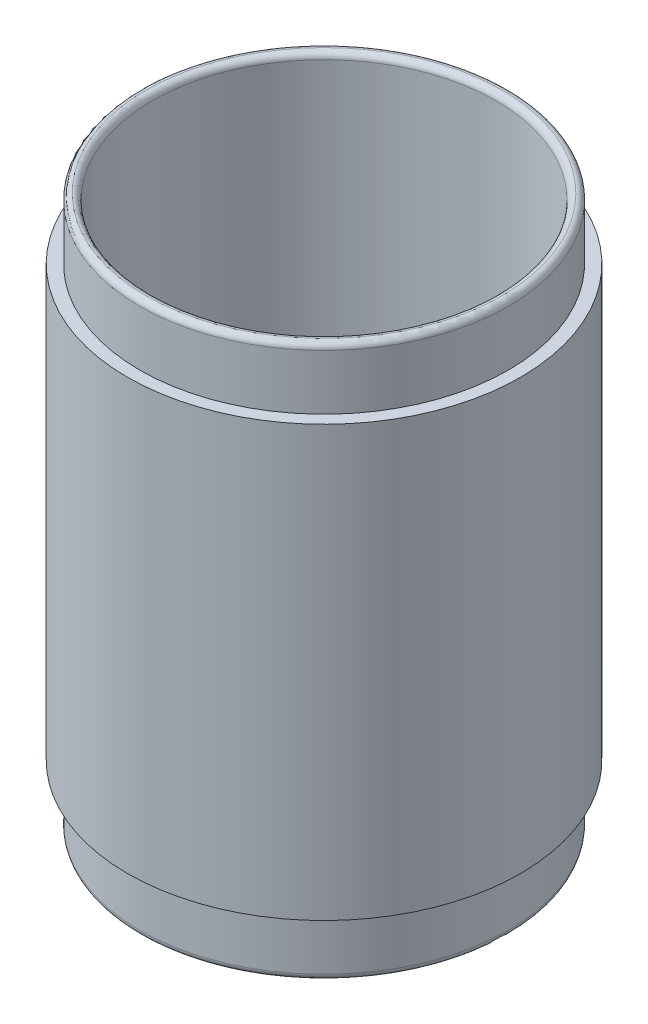
ISO-10303-21;
HEADER;
FILE_DESCRIPTION(('STEP AP214'),'2;1');
FILE_NAME('part.step','',(''),(''),'','','');
FILE_SCHEMA(('AUTOMOTIVE_DESIGN { 1 0 10303 214 1 1 1 1 }'));
ENDSEC;
DATA;
#1=APPLICATION_CONTEXT('core data for automotive mechanical design processes');
#2=APPLICATION_PROTOCOL_DEFINITION('international standard','automotive_design',2000,#1);
#3=PRODUCT_CONTEXT('',#1,'mechanical');
#4=PRODUCT('Part','Part','',(#3));
#5=PRODUCT_RELATED_PRODUCT_CATEGORY('part','',(#4));
#6=PRODUCT_DEFINITION_FORMATION('','',#4);
#7=PRODUCT_DEFINITION_CONTEXT('part definition',#1,'design');
#8=PRODUCT_DEFINITION('design','',#6,#7);
#9=PRODUCT_DEFINITION_SHAPE('','',#8);
#10=(LENGTH_UNIT() NAMED_UNIT(*) SI_UNIT(.MILLI.,.METRE.));
#11=(NAMED_UNIT(*) PLANE_ANGLE_UNIT() SI_UNIT($,.RADIAN.));
#12=(NAMED_UNIT(*) SI_UNIT($,.STERADIAN.) SOLID_ANGLE_UNIT());
#13=UNCERTAINTY_MEASURE_WITH_UNIT(LENGTH_MEASURE(1.E-05),#10,'distance_accuracy_value','');
#14=(GEOMETRIC_REPRESENTATION_CONTEXT(3) GLOBAL_UNCERTAINTY_ASSIGNED_CONTEXT((#13)) GLOBAL_UNIT_ASSIGNED_CONTEXT((#10,
#11,#12)) REPRESENTATION_CONTEXT('',''));
#15=CARTESIAN_POINT('',(0.,0.,0.));
#16=DIRECTION('',(0.,0.,1.));
#17=DIRECTION('',(1.,0.,0.));
#18=AXIS2_PLACEMENT_3D('',#15,#16,#17);
#19=CARTESIAN_POINT('',(0.,0.,0.));
#20=DIRECTION('',(0.,1.,0.));
#21=DIRECTION('',(0.,0.,1.));
#22=AXIS2_PLACEMENT_3D('',#19,#20,#21);
#23=PLANE('',#22);
#24=CARTESIAN_POINT('',(0.,0.,0.));
#25=DIRECTION('',(0.,1.,0.));
#26=DIRECTION('',(0.,0.,1.));
#27=AXIS2_PLACEMENT_3D('',#24,#25,#26);
#28=CIRCLE('',#27,16.);
#29=CARTESIAN_POINT('',(0.,0.,16.));
#30=VERTEX_POINT('',#29);
#31=EDGE_CURVE('E59',#30,#30,#28,.T.);
#32=ORIENTED_EDGE('',*,*,#31,.F.);
#33=EDGE_LOOP('',(#32));
#34=FACE_BOUND('',#33,.T.);
#35=CARTESIAN_POINT('',(0.,0.,0.));
#36=DIRECTION('',(0.,1.,0.));
#37=DIRECTION('',(0.,0.,1.));
#38=AXIS2_PLACEMENT_3D('',#35,#36,#37);
#39=CIRCLE('',#38,15.);
#40=CARTESIAN_POINT('',(0.,0.,15.));
#41=VERTEX_POINT('',#40);
#42=EDGE_CURVE('E112',#41,#41,#39,.F.);
#43=ORIENTED_EDGE('',*,*,#42,.F.);
#44=EDGE_LOOP('',(#43));
#45=FACE_BOUND('',#44,.T.);
#46=ADVANCED_FACE('F37',(#34,#45),#23,.F.);
#47=CARTESIAN_POINT('',(0.,35.,0.));
#48=DIRECTION('',(0.,1.,0.));
#49=DIRECTION('',(0.,0.,1.));
#50=AXIS2_PLACEMENT_3D('',#47,#48,#49);
#51=PLANE('',#50);
#52=CARTESIAN_POINT('',(0.,35.,0.));
#53=DIRECTION('',(0.,1.,0.));
#54=DIRECTION('',(0.,0.,1.));
#55=AXIS2_PLACEMENT_3D('',#52,#53,#54);
#56=CIRCLE('',#55,16.);
#57=CARTESIAN_POINT('',(0.,35.,16.));
#58=VERTEX_POINT('',#57);
#59=EDGE_CURVE('E117',#58,#58,#56,.T.);
#60=ORIENTED_EDGE('',*,*,#59,.T.);
#61=EDGE_LOOP('',(#60));
#62=FACE_BOUND('',#61,.T.);
#63=CARTESIAN_POINT('',(0.,35.,0.));
#64=DIRECTION('',(0.,1.,0.));
#65=DIRECTION('',(0.,0.,1.));
#66=AXIS2_PLACEMENT_3D('',#63,#64,#65);
#67=CIRCLE('',#66,15.);
#68=CARTESIAN_POINT('',(0.,35.,15.));
#69=VERTEX_POINT('',#68);
#70=EDGE_CURVE('E55',#69,#69,#67,.T.);
#71=ORIENTED_EDGE('',*,*,#70,.F.);
#72=EDGE_LOOP('',(#71));
#73=FACE_BOUND('',#72,.T.);
#74=ADVANCED_FACE('F78',(#62,#73),#51,.T.);
#75=CARTESIAN_POINT('',(0.,35.,0.));
#76=DIRECTION('',(0.,-1.,0.));
#77=DIRECTION('',(0.,0.,-1.));
#78=AXIS2_PLACEMENT_3D('',#75,#76,#77);
#79=CYLINDRICAL_SURFACE('',#78,16.);
#80=ORIENTED_EDGE('',*,*,#59,.F.);
#81=EDGE_LOOP('',(#80));
#82=FACE_BOUND('',#81,.T.);
#83=ORIENTED_EDGE('',*,*,#31,.T.);
#84=EDGE_LOOP('',(#83));
#85=FACE_BOUND('',#84,.T.);
#86=ADVANCED_FACE('F84',(#82,#85),#79,.T.);
#87=CARTESIAN_POINT('',(0.,35.,0.));
#88=DIRECTION('',(0.,-1.,0.));
#89=DIRECTION('',(0.,0.,-1.));
#90=AXIS2_PLACEMENT_3D('',#87,#88,#89);
#91=CYLINDRICAL_SURFACE('',#90,14.);
#92=CARTESIAN_POINT('',(0.,39.5,0.));
#93=DIRECTION('',(0.,1.,0.));
#94=DIRECTION('',(0.,0.,1.));
#95=AXIS2_PLACEMENT_3D('',#92,#93,#94);
#96=CIRCLE('',#95,14.);
#97=CARTESIAN_POINT('',(0.,39.5,14.));
#98=VERTEX_POINT('',#97);
#99=EDGE_CURVE('E45',#98,#98,#96,.T.);
#100=ORIENTED_EDGE('',*,*,#99,.T.);
#101=EDGE_LOOP('',(#100));
#102=FACE_BOUND('',#101,.T.);
#103=CARTESIAN_POINT('',(0.,-4.5,0.));
#104=DIRECTION('',(0.,-1.,0.));
#105=DIRECTION('',(0.,0.,-1.));
#106=AXIS2_PLACEMENT_3D('',#103,#104,#105);
#107=CIRCLE('',#106,14.);
#108=CARTESIAN_POINT('',(0.,-4.5,-14.));
#109=VERTEX_POINT('',#108);
#110=EDGE_CURVE('E50',#109,#109,#107,.T.);
#111=ORIENTED_EDGE('',*,*,#110,.T.);
#112=EDGE_LOOP('',(#111));
#113=FACE_BOUND('',#112,.T.);
#114=ADVANCED_FACE('F92',(#102,#113),#91,.F.);
#115=CARTESIAN_POINT('',(0.,40.,0.));
#116=DIRECTION('',(0.,-1.,0.));
#117=DIRECTION('',(0.,0.,-1.));
#118=AXIS2_PLACEMENT_3D('',#115,#116,#117);
#119=CYLINDRICAL_SURFACE('',#118,15.);
#120=CARTESIAN_POINT('',(0.,39.5,0.));
#121=DIRECTION('',(0.,1.,0.));
#122=DIRECTION('',(0.,0.,1.));
#123=AXIS2_PLACEMENT_3D('',#120,#121,#122);
#124=CIRCLE('',#123,15.);
#125=CARTESIAN_POINT('',(0.,39.5,15.));
#126=VERTEX_POINT('',#125);
#127=EDGE_CURVE('E110',#126,#126,#124,.F.);
#128=ORIENTED_EDGE('',*,*,#127,.T.);
#129=EDGE_LOOP('',(#128));
#130=FACE_BOUND('',#129,.T.);
#131=ORIENTED_EDGE('',*,*,#70,.T.);
#132=EDGE_LOOP('',(#131));
#133=FACE_BOUND('',#132,.T.);
#134=ADVANCED_FACE('F101',(#130,#133),#119,.T.);
#135=CARTESIAN_POINT('',(0.,-5.,0.));
#136=DIRECTION('',(0.,1.,0.));
#137=DIRECTION('',(0.,0.,1.));
#138=AXIS2_PLACEMENT_3D('',#135,#136,#137);
#139=CYLINDRICAL_SURFACE('',#138,15.);
#140=CARTESIAN_POINT('',(0.,-4.5,0.));
#141=DIRECTION('',(0.,-1.,0.));
#142=DIRECTION('',(0.,0.,-1.));
#143=AXIS2_PLACEMENT_3D('',#140,#141,#142);
#144=CIRCLE('',#143,15.);
#145=CARTESIAN_POINT('',(0.,-4.5,-15.));
#146=VERTEX_POINT('',#145);
#147=EDGE_CURVE('E10',#146,#146,#144,.F.);
#148=ORIENTED_EDGE('',*,*,#147,.T.);
#149=EDGE_LOOP('',(#148));
#150=FACE_BOUND('',#149,.T.);
#151=ORIENTED_EDGE('',*,*,#42,.T.);
#152=EDGE_LOOP('',(#151));
#153=FACE_BOUND('',#152,.T.);
#154=ADVANCED_FACE('F96',(#150,#153),#139,.T.);
#155=CARTESIAN_POINT('',(0.,39.5,0.));
#156=DIRECTION('',(0.,1.,0.));
#157=DIRECTION('',(0.,0.,1.));
#158=AXIS2_PLACEMENT_3D('',#155,#156,#157);
#159=TOROIDAL_SURFACE('',#158,14.5,0.5);
#160=ORIENTED_EDGE('',*,*,#99,.F.);
#161=EDGE_LOOP('',(#160));
#162=FACE_BOUND('',#161,.T.);
#163=CARTESIAN_POINT('',(0.,40.,0.));
#164=DIRECTION('',(0.,1.,0.));
#165=DIRECTION('',(0.,0.,1.));
#166=AXIS2_PLACEMENT_3D('',#163,#164,#165);
#167=CIRCLE('',#166,14.5);
#168=CARTESIAN_POINT('',(0.,40.,14.5));
#169=VERTEX_POINT('',#168);
#170=EDGE_CURVE('E53',#169,#169,#167,.F.);
#171=ORIENTED_EDGE('',*,*,#170,.F.);
#172=EDGE_LOOP('',(#171));
#173=FACE_BOUND('',#172,.T.);
#174=ADVANCED_FACE('F74',(#162,#173),#159,.T.);
#175=CARTESIAN_POINT('',(0.,39.5,0.));
#176=DIRECTION('',(0.,1.,0.));
#177=DIRECTION('',(0.,0.,1.));
#178=AXIS2_PLACEMENT_3D('',#175,#176,#177);
#179=TOROIDAL_SURFACE('',#178,14.5,0.5);
#180=ORIENTED_EDGE('',*,*,#127,.F.);
#181=EDGE_LOOP('',(#180));
#182=FACE_BOUND('',#181,.T.);
#183=ORIENTED_EDGE('',*,*,#170,.T.);
#184=EDGE_LOOP('',(#183));
#185=FACE_BOUND('',#184,.T.);
#186=ADVANCED_FACE('F68',(#182,#185),#179,.T.);
#187=CARTESIAN_POINT('',(0.,-4.5,0.));
#188=DIRECTION('',(0.,-1.,0.));
#189=DIRECTION('',(0.,0.,-1.));
#190=AXIS2_PLACEMENT_3D('',#187,#188,#189);
#191=TOROIDAL_SURFACE('',#190,14.5,0.5);
#192=ORIENTED_EDGE('',*,*,#147,.F.);
#193=EDGE_LOOP('',(#192));
#194=FACE_BOUND('',#193,.T.);
#195=CARTESIAN_POINT('',(0.,-5.,0.));
#196=DIRECTION('',(0.,-1.,0.));
#197=DIRECTION('',(0.,0.,-1.));
#198=AXIS2_PLACEMENT_3D('',#195,#196,#197);
#199=CIRCLE('',#198,14.5);
#200=CARTESIAN_POINT('',(0.,-5.,-14.5));
#201=VERTEX_POINT('',#200);
#202=EDGE_CURVE('E41',#201,#201,#199,.T.);
#203=ORIENTED_EDGE('',*,*,#202,.F.);
#204=EDGE_LOOP('',(#203));
#205=FACE_BOUND('',#204,.T.);
#206=ADVANCED_FACE('F39',(#194,#205),#191,.T.);
#207=CARTESIAN_POINT('',(0.,-4.5,0.));
#208=DIRECTION('',(0.,-1.,0.));
#209=DIRECTION('',(0.,0.,-1.));
#210=AXIS2_PLACEMENT_3D('',#207,#208,#209);
#211=TOROIDAL_SURFACE('',#210,14.5,0.5);
#212=ORIENTED_EDGE('',*,*,#202,.T.);
#213=EDGE_LOOP('',(#212));
#214=FACE_BOUND('',#213,.T.);
#215=ORIENTED_EDGE('',*,*,#110,.F.);
#216=EDGE_LOOP('',(#215));
#217=FACE_BOUND('',#216,.T.);
#218=ADVANCED_FACE('F64',(#214,#217),#211,.T.);
#219=CLOSED_SHELL('',(#46,#74,#86,#114,#134,#154,#174,#186,#206,#218));
#220=MANIFOLD_SOLID_BREP('B2',#219);
#221=ADVANCED_BREP_SHAPE_REPRESENTATION('',(#18,#220),#14);
#222=SHAPE_DEFINITION_REPRESENTATION(#9,#221);
ENDSEC;
END-ISO-10303-21;
